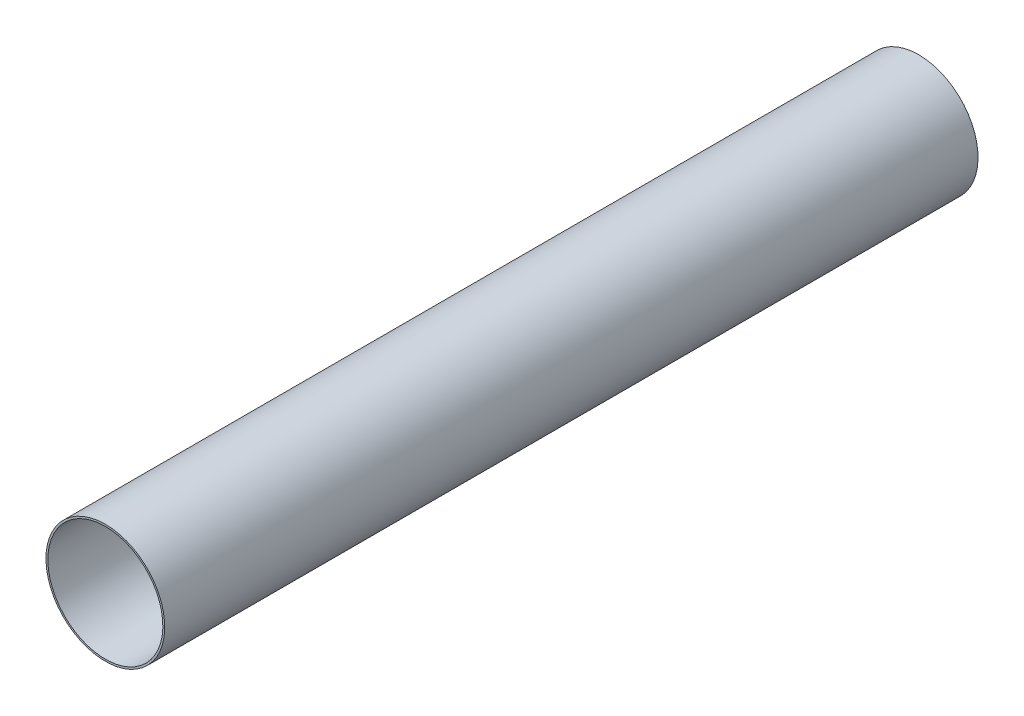
ISO-10303-21;
HEADER;
FILE_DESCRIPTION(('STEP AP214'),'2;1');
FILE_NAME('part.step','',(''),(''),'','','');
FILE_SCHEMA(('AUTOMOTIVE_DESIGN { 1 0 10303 214 1 1 1 1 }'));
ENDSEC;
DATA;
#1=APPLICATION_CONTEXT('core data for automotive mechanical design processes');
#2=APPLICATION_PROTOCOL_DEFINITION('international standard','automotive_design',2000,#1);
#3=PRODUCT_CONTEXT('',#1,'mechanical');
#4=PRODUCT('Part','Part','',(#3));
#5=PRODUCT_RELATED_PRODUCT_CATEGORY('part','',(#4));
#6=PRODUCT_DEFINITION_FORMATION('','',#4);
#7=PRODUCT_DEFINITION_CONTEXT('part definition',#1,'design');
#8=PRODUCT_DEFINITION('design','',#6,#7);
#9=PRODUCT_DEFINITION_SHAPE('','',#8);
#10=(LENGTH_UNIT() NAMED_UNIT(*) SI_UNIT(.MILLI.,.METRE.));
#11=(NAMED_UNIT(*) PLANE_ANGLE_UNIT() SI_UNIT($,.RADIAN.));
#12=(NAMED_UNIT(*) SI_UNIT($,.STERADIAN.) SOLID_ANGLE_UNIT());
#13=UNCERTAINTY_MEASURE_WITH_UNIT(LENGTH_MEASURE(1.E-05),#10,'distance_accuracy_value','');
#14=(GEOMETRIC_REPRESENTATION_CONTEXT(3) GLOBAL_UNCERTAINTY_ASSIGNED_CONTEXT((#13)) GLOBAL_UNIT_ASSIGNED_CONTEXT((#10,
#11,#12)) REPRESENTATION_CONTEXT('',''));
#15=CARTESIAN_POINT('',(0.,0.,0.));
#16=DIRECTION('',(0.,0.,1.));
#17=DIRECTION('',(1.,0.,0.));
#18=AXIS2_PLACEMENT_3D('',#15,#16,#17);
#19=CARTESIAN_POINT('',(0.,0.,0.));
#20=DIRECTION('',(0.,0.,-1.));
#21=DIRECTION('',(0.,1.,0.));
#22=AXIS2_PLACEMENT_3D('',#19,#20,#21);
#23=CYLINDRICAL_SURFACE('',#22,49.5);
#24=CARTESIAN_POINT('',(0.,0.,10.));
#25=DIRECTION('',(0.,0.,-1.));
#26=DIRECTION('',(0.,1.,0.));
#27=AXIS2_PLACEMENT_3D('',#24,#25,#26);
#28=CIRCLE('',#27,49.5);
#29=CARTESIAN_POINT('',(0.,49.5,10.));
#30=VERTEX_POINT('',#29);
#31=EDGE_CURVE('E46',#30,#30,#28,.T.);
#32=ORIENTED_EDGE('',*,*,#31,.T.);
#33=EDGE_LOOP('',(#32));
#34=FACE_BOUND('',#33,.T.);
#35=CARTESIAN_POINT('',(0.,0.,710.));
#36=DIRECTION('',(0.,0.,-1.));
#37=DIRECTION('',(0.,1.,0.));
#38=AXIS2_PLACEMENT_3D('',#35,#36,#37);
#39=CIRCLE('',#38,49.5);
#40=CARTESIAN_POINT('',(0.,49.4999999999999,710.));
#41=VERTEX_POINT('',#40);
#42=EDGE_CURVE('E10',#41,#41,#39,.T.);
#43=ORIENTED_EDGE('',*,*,#42,.F.);
#44=EDGE_LOOP('',(#43));
#45=FACE_BOUND('',#44,.T.);
#46=ADVANCED_FACE('F32',(#34,#45),#23,.F.);
#47=CARTESIAN_POINT('',(0.,49.4999999999999,710.));
#48=DIRECTION('',(0.,0.,1.));
#49=DIRECTION('',(0.,-1.,0.));
#50=AXIS2_PLACEMENT_3D('',#47,#48,#49);
#51=PLANE('',#50);
#52=ORIENTED_EDGE('',*,*,#42,.T.);
#53=EDGE_LOOP('',(#52));
#54=FACE_BOUND('',#53,.T.);
#55=CARTESIAN_POINT('',(0.,0.,710.));
#56=DIRECTION('',(0.,0.,-1.));
#57=DIRECTION('',(0.,1.,0.));
#58=AXIS2_PLACEMENT_3D('',#55,#56,#57);
#59=CIRCLE('',#58,51.1);
#60=CARTESIAN_POINT('',(0.,51.0999999999999,710.));
#61=VERTEX_POINT('',#60);
#62=EDGE_CURVE('E38',#61,#61,#59,.T.);
#63=ORIENTED_EDGE('',*,*,#62,.F.);
#64=EDGE_LOOP('',(#63));
#65=FACE_BOUND('',#64,.T.);
#66=ADVANCED_FACE('F62',(#54,#65),#51,.T.);
#67=CARTESIAN_POINT('',(0.,0.,0.));
#68=DIRECTION('',(0.,0.,-1.));
#69=DIRECTION('',(0.,1.,0.));
#70=AXIS2_PLACEMENT_3D('',#67,#68,#69);
#71=CYLINDRICAL_SURFACE('',#70,51.1);
#72=ORIENTED_EDGE('',*,*,#62,.T.);
#73=EDGE_LOOP('',(#72));
#74=FACE_BOUND('',#73,.T.);
#75=CARTESIAN_POINT('',(0.,0.,10.));
#76=DIRECTION('',(0.,0.,-1.));
#77=DIRECTION('',(0.,1.,0.));
#78=AXIS2_PLACEMENT_3D('',#75,#76,#77);
#79=CIRCLE('',#78,51.0999999999999);
#80=CARTESIAN_POINT('',(0.,51.0999999999999,10.));
#81=VERTEX_POINT('',#80);
#82=EDGE_CURVE('E42',#81,#81,#79,.T.);
#83=ORIENTED_EDGE('',*,*,#82,.F.);
#84=EDGE_LOOP('',(#83));
#85=FACE_BOUND('',#84,.T.);
#86=ADVANCED_FACE('F56',(#74,#85),#71,.T.);
#87=CARTESIAN_POINT('',(0.,51.0999999999999,10.));
#88=DIRECTION('',(0.,0.,-1.));
#89=DIRECTION('',(0.,1.,0.));
#90=AXIS2_PLACEMENT_3D('',#87,#88,#89);
#91=PLANE('',#90);
#92=ORIENTED_EDGE('',*,*,#82,.T.);
#93=EDGE_LOOP('',(#92));
#94=FACE_BOUND('',#93,.T.);
#95=ORIENTED_EDGE('',*,*,#31,.F.);
#96=EDGE_LOOP('',(#95));
#97=FACE_BOUND('',#96,.T.);
#98=ADVANCED_FACE('F54',(#94,#97),#91,.T.);
#99=CLOSED_SHELL('',(#46,#66,#86,#98));
#100=MANIFOLD_SOLID_BREP('B2',#99);
#101=ADVANCED_BREP_SHAPE_REPRESENTATION('',(#18,#100),#14);
#102=SHAPE_DEFINITION_REPRESENTATION(#9,#101);
ENDSEC;
END-ISO-10303-21;
